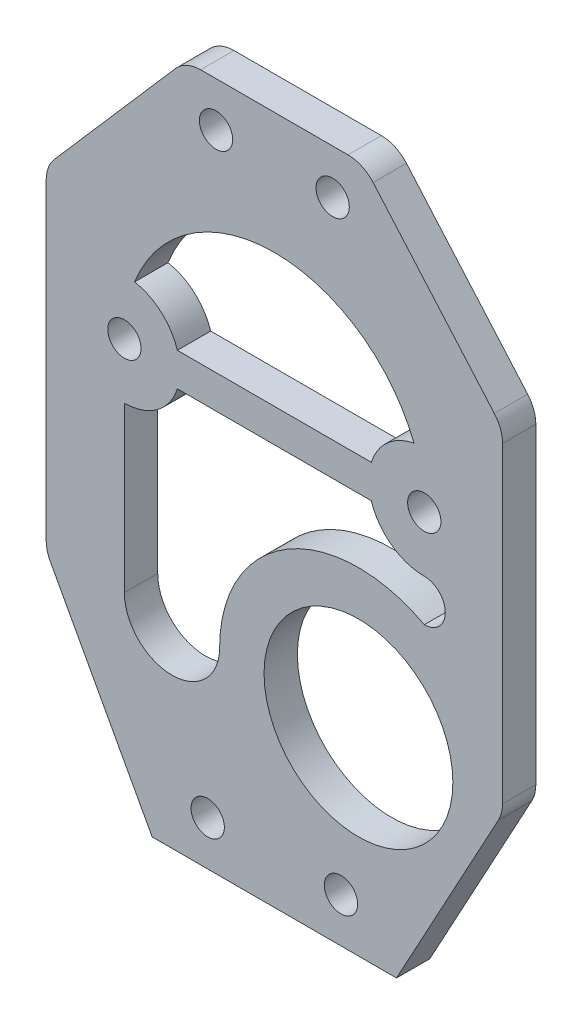
ISO-10303-21;
HEADER;
FILE_DESCRIPTION(('STEP AP214'),'2;1');
FILE_NAME('part.step','',(''),(''),'','','');
FILE_SCHEMA(('AUTOMOTIVE_DESIGN { 1 0 10303 214 1 1 1 1 }'));
ENDSEC;
DATA;
#1=APPLICATION_CONTEXT('core data for automotive mechanical design processes');
#2=APPLICATION_PROTOCOL_DEFINITION('international standard','automotive_design',2000,#1);
#3=PRODUCT_CONTEXT('',#1,'mechanical');
#4=PRODUCT('Part','Part','',(#3));
#5=PRODUCT_RELATED_PRODUCT_CATEGORY('part','',(#4));
#6=PRODUCT_DEFINITION_FORMATION('','',#4);
#7=PRODUCT_DEFINITION_CONTEXT('part definition',#1,'design');
#8=PRODUCT_DEFINITION('design','',#6,#7);
#9=PRODUCT_DEFINITION_SHAPE('','',#8);
#10=(LENGTH_UNIT() NAMED_UNIT(*) SI_UNIT(.MILLI.,.METRE.));
#11=(NAMED_UNIT(*) PLANE_ANGLE_UNIT() SI_UNIT($,.RADIAN.));
#12=(NAMED_UNIT(*) SI_UNIT($,.STERADIAN.) SOLID_ANGLE_UNIT());
#13=UNCERTAINTY_MEASURE_WITH_UNIT(LENGTH_MEASURE(1.E-05),#10,'distance_accuracy_value','');
#14=(GEOMETRIC_REPRESENTATION_CONTEXT(3) GLOBAL_UNCERTAINTY_ASSIGNED_CONTEXT((#13)) GLOBAL_UNIT_ASSIGNED_CONTEXT((#10,
#11,#12)) REPRESENTATION_CONTEXT('',''));
#15=CARTESIAN_POINT('',(0.,0.,0.));
#16=DIRECTION('',(0.,0.,1.));
#17=DIRECTION('',(1.,0.,0.));
#18=AXIS2_PLACEMENT_3D('',#15,#16,#17);
#19=CARTESIAN_POINT('',(-13.5,0.,3.));
#20=DIRECTION('',(1.,0.,0.));
#21=DIRECTION('',(0.,1.,0.));
#22=AXIS2_PLACEMENT_3D('',#19,#20,#21);
#23=PLANE('',#22);
#24=DIRECTION('',(0.,-1.,0.));
#25=VECTOR('',#24,1.);
#26=CARTESIAN_POINT('',(-13.5,0.,0.));
#27=LINE('',#26,#25);
#28=CARTESIAN_POINT('',(-13.5,32.5763422532393,0.));
#29=VERTEX_POINT('',#28);
#30=CARTESIAN_POINT('',(-13.5,17.790765320253,0.));
#31=VERTEX_POINT('',#30);
#32=EDGE_CURVE('E360',#29,#31,#27,.T.);
#33=ORIENTED_EDGE('',*,*,#32,.F.);
#34=DIRECTION('',(0.,0.,-1.));
#35=VECTOR('',#34,1.);
#36=CARTESIAN_POINT('',(-13.5,32.5763422532393,3.));
#37=LINE('',#36,#35);
#38=CARTESIAN_POINT('',(-13.5,32.5763422532393,3.));
#39=VERTEX_POINT('',#38);
#40=EDGE_CURVE('E392',#39,#29,#37,.T.);
#41=ORIENTED_EDGE('',*,*,#40,.F.);
#42=DIRECTION('',(0.,-1.,0.));
#43=VECTOR('',#42,1.);
#44=CARTESIAN_POINT('',(-13.5,0.,3.));
#45=LINE('',#44,#43);
#46=CARTESIAN_POINT('',(-13.5,17.790765320253,3.));
#47=VERTEX_POINT('',#46);
#48=EDGE_CURVE('E287',#39,#47,#45,.T.);
#49=ORIENTED_EDGE('',*,*,#48,.T.);
#50=DIRECTION('',(0.,0.,-1.));
#51=VECTOR('',#50,1.);
#52=CARTESIAN_POINT('',(-13.5,17.790765320253,3.));
#53=LINE('',#52,#51);
#54=EDGE_CURVE('E377',#47,#31,#53,.T.);
#55=ORIENTED_EDGE('',*,*,#54,.T.);
#56=EDGE_LOOP('',(#33,#41,#49,#55));
#57=FACE_BOUND('',#56,.T.);
#58=ADVANCED_FACE('F41',(#57),#23,.T.);
#59=CARTESIAN_POINT('',(-13.5,37.5763422532393,3.));
#60=DIRECTION('',(0.,0.,-1.));
#61=DIRECTION('',(-1.,0.,0.));
#62=AXIS2_PLACEMENT_3D('',#59,#60,#61);
#63=CYLINDRICAL_SURFACE('',#62,5.);
#64=CARTESIAN_POINT('',(-13.5,37.5763422532393,0.));
#65=DIRECTION('',(0.,0.,1.));
#66=DIRECTION('',(1.,0.,0.));
#67=AXIS2_PLACEMENT_3D('',#64,#65,#66);
#68=CIRCLE('',#67,5.);
#69=CARTESIAN_POINT('',(-8.73030399291527,36.0763422532393,0.));
#70=VERTEX_POINT('',#69);
#71=EDGE_CURVE('E363',#29,#70,#68,.T.);
#72=ORIENTED_EDGE('',*,*,#71,.T.);
#73=DIRECTION('',(0.,0.,-1.));
#74=VECTOR('',#73,1.);
#75=CARTESIAN_POINT('',(-8.73030399291527,36.0763422532393,3.));
#76=LINE('',#75,#74);
#77=CARTESIAN_POINT('',(-8.73030399291527,36.0763422532393,3.));
#78=VERTEX_POINT('',#77);
#79=EDGE_CURVE('E389',#78,#70,#76,.T.);
#80=ORIENTED_EDGE('',*,*,#79,.F.);
#81=CARTESIAN_POINT('',(-13.5,37.5763422532393,3.));
#82=DIRECTION('',(0.,0.,1.));
#83=DIRECTION('',(1.,0.,0.));
#84=AXIS2_PLACEMENT_3D('',#81,#82,#83);
#85=CIRCLE('',#84,5.);
#86=EDGE_CURVE('E290',#39,#78,#85,.T.);
#87=ORIENTED_EDGE('',*,*,#86,.F.);
#88=ORIENTED_EDGE('',*,*,#40,.T.);
#89=EDGE_LOOP('',(#72,#80,#87,#88));
#90=FACE_BOUND('',#89,.T.);
#91=ADVANCED_FACE('F516',(#90),#63,.T.);
#92=CARTESIAN_POINT('',(0.,36.0763422532393,3.));
#93=DIRECTION('',(0.,1.,0.));
#94=DIRECTION('',(0.,0.,1.));
#95=AXIS2_PLACEMENT_3D('',#92,#93,#94);
#96=PLANE('',#95);
#97=DIRECTION('',(1.,0.,0.));
#98=VECTOR('',#97,1.);
#99=CARTESIAN_POINT('',(0.,36.0763422532393,0.));
#100=LINE('',#99,#98);
#101=CARTESIAN_POINT('',(8.73030399291527,36.0763422532393,0.));
#102=VERTEX_POINT('',#101);
#103=EDGE_CURVE('E366',#70,#102,#100,.T.);
#104=ORIENTED_EDGE('',*,*,#103,.T.);
#105=DIRECTION('',(0.,0.,-1.));
#106=VECTOR('',#105,1.);
#107=CARTESIAN_POINT('',(8.73030399291527,36.0763422532393,3.));
#108=LINE('',#107,#106);
#109=CARTESIAN_POINT('',(8.73030399291527,36.0763422532393,3.));
#110=VERTEX_POINT('',#109);
#111=EDGE_CURVE('E386',#110,#102,#108,.T.);
#112=ORIENTED_EDGE('',*,*,#111,.F.);
#113=DIRECTION('',(1.,0.,0.));
#114=VECTOR('',#113,1.);
#115=CARTESIAN_POINT('',(0.,36.0763422532393,3.));
#116=LINE('',#115,#114);
#117=EDGE_CURVE('E293',#78,#110,#116,.T.);
#118=ORIENTED_EDGE('',*,*,#117,.F.);
#119=ORIENTED_EDGE('',*,*,#79,.T.);
#120=EDGE_LOOP('',(#104,#112,#118,#119));
#121=FACE_BOUND('',#120,.T.);
#122=ADVANCED_FACE('F522',(#121),#96,.F.);
#123=CARTESIAN_POINT('',(13.5,37.5763422532393,3.));
#124=DIRECTION('',(0.,0.,-1.));
#125=DIRECTION('',(-1.,0.,0.));
#126=AXIS2_PLACEMENT_3D('',#123,#124,#125);
#127=CYLINDRICAL_SURFACE('',#126,5.);
#128=CARTESIAN_POINT('',(13.5,37.5763422532393,0.));
#129=DIRECTION('',(0.,0.,1.));
#130=DIRECTION('',(1.,0.,0.));
#131=AXIS2_PLACEMENT_3D('',#128,#129,#130);
#132=CIRCLE('',#131,5.);
#133=CARTESIAN_POINT('',(13.5,32.5763422532393,0.));
#134=VERTEX_POINT('',#133);
#135=EDGE_CURVE('E369',#102,#134,#132,.T.);
#136=ORIENTED_EDGE('',*,*,#135,.T.);
#137=DIRECTION('',(0.,0.,-1.));
#138=VECTOR('',#137,1.);
#139=CARTESIAN_POINT('',(13.5,32.5763422532393,3.));
#140=LINE('',#139,#138);
#141=CARTESIAN_POINT('',(13.5,32.5763422532393,3.));
#142=VERTEX_POINT('',#141);
#143=EDGE_CURVE('E384',#142,#134,#140,.T.);
#144=ORIENTED_EDGE('',*,*,#143,.F.);
#145=CARTESIAN_POINT('',(13.5,37.5763422532393,3.));
#146=DIRECTION('',(0.,0.,1.));
#147=DIRECTION('',(1.,0.,0.));
#148=AXIS2_PLACEMENT_3D('',#145,#146,#147);
#149=CIRCLE('',#148,5.);
#150=EDGE_CURVE('E296',#110,#142,#149,.T.);
#151=ORIENTED_EDGE('',*,*,#150,.F.);
#152=ORIENTED_EDGE('',*,*,#111,.T.);
#153=EDGE_LOOP('',(#136,#144,#151,#152));
#154=FACE_BOUND('',#153,.T.);
#155=ADVANCED_FACE('F775',(#154),#127,.T.);
#156=CARTESIAN_POINT('',(13.5,30.6865179861669,3.));
#157=DIRECTION('',(0.,0.,-1.));
#158=DIRECTION('',(-1.,0.,0.));
#159=AXIS2_PLACEMENT_3D('',#156,#157,#158);
#160=CYLINDRICAL_SURFACE('',#159,1.88982426707241);
#161=CARTESIAN_POINT('',(13.5,30.6865179861669,0.));
#162=DIRECTION('',(0.,0.,1.));
#163=DIRECTION('',(1.,0.,0.));
#164=AXIS2_PLACEMENT_3D('',#161,#162,#163);
#165=CIRCLE('',#164,1.88982426707241);
#166=CARTESIAN_POINT('',(13.5,28.7966937190945,0.));
#167=VERTEX_POINT('',#166);
#168=EDGE_CURVE('E372',#167,#134,#165,.T.);
#169=ORIENTED_EDGE('',*,*,#168,.F.);
#170=DIRECTION('',(0.,0.,-1.));
#171=VECTOR('',#170,1.);
#172=CARTESIAN_POINT('',(13.5,28.7966937190945,3.));
#173=LINE('',#172,#171);
#174=CARTESIAN_POINT('',(13.5,28.7966937190945,3.));
#175=VERTEX_POINT('',#174);
#176=EDGE_CURVE('E382',#175,#167,#173,.T.);
#177=ORIENTED_EDGE('',*,*,#176,.F.);
#178=CARTESIAN_POINT('',(13.5,30.6865179861669,3.));
#179=DIRECTION('',(0.,0.,1.));
#180=DIRECTION('',(1.,0.,0.));
#181=AXIS2_PLACEMENT_3D('',#178,#179,#180);
#182=CIRCLE('',#181,1.88982426707241);
#183=EDGE_CURVE('E298',#175,#142,#182,.T.);
#184=ORIENTED_EDGE('',*,*,#183,.T.);
#185=ORIENTED_EDGE('',*,*,#143,.T.);
#186=EDGE_LOOP('',(#169,#177,#184,#185));
#187=FACE_BOUND('',#186,.T.);
#188=ADVANCED_FACE('F766',(#187),#160,.F.);
#189=CARTESIAN_POINT('',(7.57382584802186,17.790765320253,3.));
#190=DIRECTION('',(0.,0.,-1.));
#191=DIRECTION('',(-1.,0.,0.));
#192=AXIS2_PLACEMENT_3D('',#189,#190,#191);
#193=CYLINDRICAL_SURFACE('',#192,12.5);
#194=CARTESIAN_POINT('',(7.57382584802186,17.790765320253,0.));
#195=DIRECTION('',(0.,0.,1.));
#196=DIRECTION('',(1.,0.,0.));
#197=AXIS2_PLACEMENT_3D('',#194,#195,#196);
#198=CIRCLE('',#197,12.5);
#199=CARTESIAN_POINT('',(-4.92617415197814,17.790765320253,0.));
#200=VERTEX_POINT('',#199);
#201=EDGE_CURVE('E239',#167,#200,#198,.T.);
#202=ORIENTED_EDGE('',*,*,#201,.T.);
#203=DIRECTION('',(0.,0.,-1.));
#204=VECTOR('',#203,1.);
#205=CARTESIAN_POINT('',(-4.92617415197814,17.790765320253,3.));
#206=LINE('',#205,#204);
#207=CARTESIAN_POINT('',(-4.92617415197814,17.790765320253,3.));
#208=VERTEX_POINT('',#207);
#209=EDGE_CURVE('E379',#208,#200,#206,.T.);
#210=ORIENTED_EDGE('',*,*,#209,.F.);
#211=CARTESIAN_POINT('',(7.57382584802186,17.790765320253,3.));
#212=DIRECTION('',(0.,0.,1.));
#213=DIRECTION('',(1.,0.,0.));
#214=AXIS2_PLACEMENT_3D('',#211,#212,#213);
#215=CIRCLE('',#214,12.5);
#216=EDGE_CURVE('E301',#175,#208,#215,.T.);
#217=ORIENTED_EDGE('',*,*,#216,.F.);
#218=ORIENTED_EDGE('',*,*,#176,.T.);
#219=EDGE_LOOP('',(#202,#210,#217,#218));
#220=FACE_BOUND('',#219,.T.);
#221=ADVANCED_FACE('F759',(#220),#193,.T.);
#222=CARTESIAN_POINT('',(-35.255136379797,30.6587524647866,3.));
#223=DIRECTION('',(-0.754583137173265,0.656204456776814,0.));
#224=DIRECTION('',(-0.656204456776814,-0.754583137173265,0.));
#225=AXIS2_PLACEMENT_3D('',#222,#223,#224);
#226=PLANE('',#225);
#227=DIRECTION('',(0.656204456776814,0.754583137173265,0.));
#228=VECTOR('',#227,1.);
#229=CARTESIAN_POINT('',(-35.255136379797,30.6587524647866,3.));
#230=LINE('',#229,#228);
#231=CARTESIAN_POINT('',(-19.8069246167119,48.4229721001774,3.));
#232=VERTEX_POINT('',#231);
#233=CARTESIAN_POINT('',(-8.89691972919582,60.9686133703304,3.));
#234=VERTEX_POINT('',#233);
#235=EDGE_CURVE('E265',#232,#234,#230,.T.);
#236=ORIENTED_EDGE('',*,*,#235,.T.);
#237=DIRECTION('',(0.,0.,-1.));
#238=VECTOR('',#237,1.);
#239=CARTESIAN_POINT('',(-8.89691972919582,60.9686133703304,0.));
#240=LINE('',#239,#238);
#241=CARTESIAN_POINT('',(-8.89691972919582,60.9686133703304,0.));
#242=VERTEX_POINT('',#241);
#243=EDGE_CURVE('E442',#234,#242,#240,.T.);
#244=ORIENTED_EDGE('',*,*,#243,.T.);
#245=DIRECTION('',(0.656204456776814,0.754583137173265,0.));
#246=VECTOR('',#245,1.);
#247=CARTESIAN_POINT('',(-35.255136379797,30.6587524647866,0.));
#248=LINE('',#247,#246);
#249=CARTESIAN_POINT('',(-19.8069246167119,48.4229721001774,0.));
#250=VERTEX_POINT('',#249);
#251=EDGE_CURVE('E337',#250,#242,#248,.T.);
#252=ORIENTED_EDGE('',*,*,#251,.F.);
#253=DIRECTION('',(0.,0.,-1.));
#254=VECTOR('',#253,1.);
#255=CARTESIAN_POINT('',(-19.8069246167119,48.4229721001774,3.));
#256=LINE('',#255,#254);
#257=EDGE_CURVE('E440',#250,#232,#256,.F.);
#258=ORIENTED_EDGE('',*,*,#257,.T.);
#259=EDGE_LOOP('',(#236,#244,#252,#258));
#260=FACE_BOUND('',#259,.T.);
#261=ADVANCED_FACE('F475',(#260),#226,.T.);
#262=CARTESIAN_POINT('',(-20.5431752051921,0.,3.));
#263=DIRECTION('',(-1.,0.,0.));
#264=DIRECTION('',(0.,0.,1.));
#265=AXIS2_PLACEMENT_3D('',#262,#263,#264);
#266=PLANE('',#265);
#267=DIRECTION('',(0.,1.,0.));
#268=VECTOR('',#267,1.);
#269=CARTESIAN_POINT('',(-20.5431752051921,0.,3.));
#270=LINE('',#269,#268);
#271=CARTESIAN_POINT('',(-20.5431752051921,18.3382451926642,3.));
#272=VERTEX_POINT('',#271);
#273=CARTESIAN_POINT('',(-20.5431752051921,46.454358729847,3.));
#274=VERTEX_POINT('',#273);
#275=EDGE_CURVE('E268',#272,#274,#270,.T.);
#276=ORIENTED_EDGE('',*,*,#275,.T.);
#277=DIRECTION('',(0.,0.,-1.));
#278=VECTOR('',#277,1.);
#279=CARTESIAN_POINT('',(-20.5431752051921,46.454358729847,3.));
#280=LINE('',#279,#278);
#281=CARTESIAN_POINT('',(-20.5431752051921,46.454358729847,0.));
#282=VERTEX_POINT('',#281);
#283=EDGE_CURVE('E49',#274,#282,#280,.T.);
#284=ORIENTED_EDGE('',*,*,#283,.T.);
#285=DIRECTION('',(0.,1.,0.));
#286=VECTOR('',#285,1.);
#287=CARTESIAN_POINT('',(-20.5431752051921,0.,0.));
#288=LINE('',#287,#286);
#289=CARTESIAN_POINT('',(-20.5431752051921,18.3382451926642,0.));
#290=VERTEX_POINT('',#289);
#291=EDGE_CURVE('E340',#290,#282,#288,.T.);
#292=ORIENTED_EDGE('',*,*,#291,.F.);
#293=DIRECTION('',(0.,0.,-1.));
#294=VECTOR('',#293,1.);
#295=CARTESIAN_POINT('',(-20.5431752051921,18.3382451926642,3.));
#296=LINE('',#295,#294);
#297=EDGE_CURVE('E445',#290,#272,#296,.F.);
#298=ORIENTED_EDGE('',*,*,#297,.T.);
#299=EDGE_LOOP('',(#276,#284,#292,#298));
#300=FACE_BOUND('',#299,.T.);
#301=ADVANCED_FACE('F450',(#300),#266,.T.);
#302=CARTESIAN_POINT('',(-8.49551469258267,-4.61268812369982,3.));
#303=DIRECTION('',(-0.878817112661967,-0.477158760259606,0.));
#304=DIRECTION('',(0.477158760259606,-0.878817112661967,0.));
#305=AXIS2_PLACEMENT_3D('',#302,#303,#304);
#306=PLANE('',#305);
#307=DIRECTION('',(-0.477158760259606,0.878817112661967,0.));
#308=VECTOR('',#307,1.);
#309=CARTESIAN_POINT('',(-8.49551469258267,-4.61268812369982,3.));
#310=LINE('',#309,#308);
#311=CARTESIAN_POINT('',(-11.,0.,3.));
#312=VERTEX_POINT('',#311);
#313=CARTESIAN_POINT('',(-20.179626543178,16.9067689118853,3.));
#314=VERTEX_POINT('',#313);
#315=EDGE_CURVE('E271',#312,#314,#310,.T.);
#316=ORIENTED_EDGE('',*,*,#315,.T.);
#317=DIRECTION('',(0.,0.,-1.));
#318=VECTOR('',#317,1.);
#319=CARTESIAN_POINT('',(-20.179626543178,16.9067689118853,3.));
#320=LINE('',#319,#318);
#321=CARTESIAN_POINT('',(-20.179626543178,16.9067689118853,0.));
#322=VERTEX_POINT('',#321);
#323=EDGE_CURVE('E11',#314,#322,#320,.T.);
#324=ORIENTED_EDGE('',*,*,#323,.T.);
#325=DIRECTION('',(-0.477158760259606,0.878817112661967,0.));
#326=VECTOR('',#325,1.);
#327=CARTESIAN_POINT('',(-8.49551469258267,-4.61268812369982,0.));
#328=LINE('',#327,#326);
#329=CARTESIAN_POINT('',(-11.,0.,0.));
#330=VERTEX_POINT('',#329);
#331=EDGE_CURVE('E343',#330,#322,#328,.T.);
#332=ORIENTED_EDGE('',*,*,#331,.F.);
#333=DIRECTION('',(0.,0.,-1.));
#334=VECTOR('',#333,1.);
#335=CARTESIAN_POINT('',(-11.,0.,3.));
#336=LINE('',#335,#334);
#337=EDGE_CURVE('E380',#312,#330,#336,.T.);
#338=ORIENTED_EDGE('',*,*,#337,.F.);
#339=EDGE_LOOP('',(#316,#324,#332,#338));
#340=FACE_BOUND('',#339,.T.);
#341=ADVANCED_FACE('F466',(#340),#306,.T.);
#342=CARTESIAN_POINT('',(0.,0.,3.));
#343=DIRECTION('',(0.,1.,0.));
#344=DIRECTION('',(0.,0.,1.));
#345=AXIS2_PLACEMENT_3D('',#342,#343,#344);
#346=PLANE('',#345);
#347=DIRECTION('',(1.,0.,0.));
#348=VECTOR('',#347,1.);
#349=CARTESIAN_POINT('',(0.,0.,0.));
#350=LINE('',#349,#348);
#351=CARTESIAN_POINT('',(11.,0.,0.));
#352=VERTEX_POINT('',#351);
#353=EDGE_CURVE('E346',#330,#352,#350,.T.);
#354=ORIENTED_EDGE('',*,*,#353,.T.);
#355=DIRECTION('',(0.,0.,-1.));
#356=VECTOR('',#355,1.);
#357=CARTESIAN_POINT('',(11.,0.,3.));
#358=LINE('',#357,#356);
#359=CARTESIAN_POINT('',(11.,0.,3.));
#360=VERTEX_POINT('',#359);
#361=EDGE_CURVE('E220',#360,#352,#358,.T.);
#362=ORIENTED_EDGE('',*,*,#361,.F.);
#363=DIRECTION('',(1.,0.,0.));
#364=VECTOR('',#363,1.);
#365=CARTESIAN_POINT('',(0.,0.,3.));
#366=LINE('',#365,#364);
#367=EDGE_CURVE('E274',#312,#360,#366,.T.);
#368=ORIENTED_EDGE('',*,*,#367,.F.);
#369=ORIENTED_EDGE('',*,*,#337,.T.);
#370=EDGE_LOOP('',(#354,#362,#368,#369));
#371=FACE_BOUND('',#370,.T.);
#372=ADVANCED_FACE('F506',(#371),#346,.F.);
#373=CARTESIAN_POINT('',(8.49551469258267,-4.61268812369982,3.));
#374=DIRECTION('',(-0.878817112661967,0.477158760259606,0.));
#375=DIRECTION('',(-0.477158760259606,-0.878817112661967,0.));
#376=AXIS2_PLACEMENT_3D('',#373,#374,#375);
#377=PLANE('',#376);
#378=DIRECTION('',(0.477158760259606,0.878817112661967,0.));
#379=VECTOR('',#378,1.);
#380=CARTESIAN_POINT('',(8.49551469258267,-4.61268812369982,0.));
#381=LINE('',#380,#379);
#382=CARTESIAN_POINT('',(20.179626543178,16.9067689118853,0.));
#383=VERTEX_POINT('',#382);
#384=EDGE_CURVE('E349',#352,#383,#381,.T.);
#385=ORIENTED_EDGE('',*,*,#384,.T.);
#386=DIRECTION('',(0.,0.,-1.));
#387=VECTOR('',#386,1.);
#388=CARTESIAN_POINT('',(20.179626543178,16.9067689118853,3.));
#389=LINE('',#388,#387);
#390=CARTESIAN_POINT('',(20.179626543178,16.9067689118853,3.));
#391=VERTEX_POINT('',#390);
#392=EDGE_CURVE('E418',#383,#391,#389,.F.);
#393=ORIENTED_EDGE('',*,*,#392,.T.);
#394=DIRECTION('',(0.477158760259606,0.878817112661967,0.));
#395=VECTOR('',#394,1.);
#396=CARTESIAN_POINT('',(8.49551469258267,-4.61268812369982,3.));
#397=LINE('',#396,#395);
#398=EDGE_CURVE('E277',#360,#391,#397,.T.);
#399=ORIENTED_EDGE('',*,*,#398,.F.);
#400=ORIENTED_EDGE('',*,*,#361,.T.);
#401=EDGE_LOOP('',(#385,#393,#399,#400));
#402=FACE_BOUND('',#401,.T.);
#403=ADVANCED_FACE('F504',(#402),#377,.F.);
#404=CARTESIAN_POINT('',(20.5431752051921,0.,3.));
#405=DIRECTION('',(-1.,0.,0.));
#406=DIRECTION('',(0.,0.,1.));
#407=AXIS2_PLACEMENT_3D('',#404,#405,#406);
#408=PLANE('',#407);
#409=DIRECTION('',(0.,1.,0.));
#410=VECTOR('',#409,1.);
#411=CARTESIAN_POINT('',(20.5431752051921,0.,3.));
#412=LINE('',#411,#410);
#413=CARTESIAN_POINT('',(20.5431752051921,18.3382451926642,3.));
#414=VERTEX_POINT('',#413);
#415=CARTESIAN_POINT('',(20.5431752051921,46.454358729847,3.));
#416=VERTEX_POINT('',#415);
#417=EDGE_CURVE('E280',#414,#416,#412,.T.);
#418=ORIENTED_EDGE('',*,*,#417,.F.);
#419=DIRECTION('',(0.,0.,-1.));
#420=VECTOR('',#419,1.);
#421=CARTESIAN_POINT('',(20.5431752051921,18.3382451926642,3.));
#422=LINE('',#421,#420);
#423=CARTESIAN_POINT('',(20.5431752051921,18.3382451926642,0.));
#424=VERTEX_POINT('',#423);
#425=EDGE_CURVE('E403',#414,#424,#422,.T.);
#426=ORIENTED_EDGE('',*,*,#425,.T.);
#427=DIRECTION('',(0.,1.,0.));
#428=VECTOR('',#427,1.);
#429=CARTESIAN_POINT('',(20.5431752051921,0.,0.));
#430=LINE('',#429,#428);
#431=CARTESIAN_POINT('',(20.5431752051921,46.454358729847,0.));
#432=VERTEX_POINT('',#431);
#433=EDGE_CURVE('E352',#424,#432,#430,.T.);
#434=ORIENTED_EDGE('',*,*,#433,.T.);
#435=DIRECTION('',(0.,0.,-1.));
#436=VECTOR('',#435,1.);
#437=CARTESIAN_POINT('',(20.5431752051921,46.454358729847,3.));
#438=LINE('',#437,#436);
#439=EDGE_CURVE('E394',#432,#416,#438,.F.);
#440=ORIENTED_EDGE('',*,*,#439,.T.);
#441=EDGE_LOOP('',(#418,#426,#434,#440));
#442=FACE_BOUND('',#441,.T.);
#443=ADVANCED_FACE('F497',(#442),#408,.F.);
#444=CARTESIAN_POINT('',(35.255136379797,30.6587524647866,3.));
#445=DIRECTION('',(-0.754583137173265,-0.656204456776814,0.));
#446=DIRECTION('',(0.656204456776814,-0.754583137173265,0.));
#447=AXIS2_PLACEMENT_3D('',#444,#445,#446);
#448=PLANE('',#447);
#449=DIRECTION('',(-0.656204456776814,0.754583137173265,0.));
#450=VECTOR('',#449,1.);
#451=CARTESIAN_POINT('',(35.255136379797,30.6587524647866,3.));
#452=LINE('',#451,#450);
#453=CARTESIAN_POINT('',(19.8069246167119,48.4229721001774,3.));
#454=VERTEX_POINT('',#453);
#455=CARTESIAN_POINT('',(8.89691972919582,60.9686133703304,3.));
#456=VERTEX_POINT('',#455);
#457=EDGE_CURVE('E283',#454,#456,#452,.T.);
#458=ORIENTED_EDGE('',*,*,#457,.F.);
#459=DIRECTION('',(0.,0.,-1.));
#460=VECTOR('',#459,1.);
#461=CARTESIAN_POINT('',(19.8069246167119,48.4229721001774,3.));
#462=LINE('',#461,#460);
#463=CARTESIAN_POINT('',(19.8069246167119,48.4229721001774,0.));
#464=VERTEX_POINT('',#463);
#465=EDGE_CURVE('E433',#454,#464,#462,.T.);
#466=ORIENTED_EDGE('',*,*,#465,.T.);
#467=DIRECTION('',(-0.656204456776814,0.754583137173265,0.));
#468=VECTOR('',#467,1.);
#469=CARTESIAN_POINT('',(35.255136379797,30.6587524647866,0.));
#470=LINE('',#469,#468);
#471=CARTESIAN_POINT('',(8.89691972919582,60.9686133703304,0.));
#472=VERTEX_POINT('',#471);
#473=EDGE_CURVE('E355',#464,#472,#470,.T.);
#474=ORIENTED_EDGE('',*,*,#473,.T.);
#475=DIRECTION('',(0.,0.,-1.));
#476=VECTOR('',#475,1.);
#477=CARTESIAN_POINT('',(8.89691972919582,60.9686133703304,3.));
#478=LINE('',#477,#476);
#479=EDGE_CURVE('E431',#472,#456,#478,.F.);
#480=ORIENTED_EDGE('',*,*,#479,.T.);
#481=EDGE_LOOP('',(#458,#466,#474,#480));
#482=FACE_BOUND('',#481,.T.);
#483=ADVANCED_FACE('F489',(#482),#448,.F.);
#484=CARTESIAN_POINT('',(0.,37.5763422532393,3.));
#485=DIRECTION('',(0.,0.,-1.));
#486=DIRECTION('',(-1.,0.,0.));
#487=AXIS2_PLACEMENT_3D('',#484,#485,#486);
#488=CYLINDRICAL_SURFACE('',#487,13.5);
#489=CARTESIAN_POINT('',(0.,37.5763422532393,0.));
#490=DIRECTION('',(0.,0.,1.));
#491=DIRECTION('',(1.,0.,0.));
#492=AXIS2_PLACEMENT_3D('',#489,#490,#491);
#493=CIRCLE('',#492,13.5);
#494=CARTESIAN_POINT('',(12.5740740740741,42.4898604611733,0.));
#495=VERTEX_POINT('',#494);
#496=CARTESIAN_POINT('',(-12.5740740740741,42.4898604611733,0.));
#497=VERTEX_POINT('',#496);
#498=EDGE_CURVE('E216',#495,#497,#493,.T.);
#499=ORIENTED_EDGE('',*,*,#498,.F.);
#500=DIRECTION('',(0.,0.,-1.));
#501=VECTOR('',#500,1.);
#502=CARTESIAN_POINT('',(12.5740740740741,42.4898604611733,3.));
#503=LINE('',#502,#501);
#504=CARTESIAN_POINT('',(12.5740740740741,42.4898604611733,3.));
#505=VERTEX_POINT('',#504);
#506=EDGE_CURVE('E210',#505,#495,#503,.T.);
#507=ORIENTED_EDGE('',*,*,#506,.F.);
#508=CARTESIAN_POINT('',(0.,37.5763422532393,3.));
#509=DIRECTION('',(0.,0.,1.));
#510=DIRECTION('',(1.,0.,0.));
#511=AXIS2_PLACEMENT_3D('',#508,#509,#510);
#512=CIRCLE('',#511,13.5);
#513=CARTESIAN_POINT('',(-12.5740740740741,42.4898604611733,3.));
#514=VERTEX_POINT('',#513);
#515=EDGE_CURVE('E214',#505,#514,#512,.T.);
#516=ORIENTED_EDGE('',*,*,#515,.T.);
#517=DIRECTION('',(0.,0.,-1.));
#518=VECTOR('',#517,1.);
#519=CARTESIAN_POINT('',(-12.5740740740741,42.4898604611733,3.));
#520=LINE('',#519,#518);
#521=EDGE_CURVE('E306',#514,#497,#520,.T.);
#522=ORIENTED_EDGE('',*,*,#521,.T.);
#523=EDGE_LOOP('',(#499,#507,#516,#522));
#524=FACE_BOUND('',#523,.T.);
#525=ADVANCED_FACE('F212',(#524),#488,.F.);
#526=CARTESIAN_POINT('',(13.5,37.5763422532393,3.));
#527=DIRECTION('',(0.,0.,-1.));
#528=DIRECTION('',(-1.,0.,0.));
#529=AXIS2_PLACEMENT_3D('',#526,#527,#528);
#530=CYLINDRICAL_SURFACE('',#529,5.);
#531=CARTESIAN_POINT('',(13.5,37.5763422532393,0.));
#532=DIRECTION('',(0.,0.,1.));
#533=DIRECTION('',(1.,0.,0.));
#534=AXIS2_PLACEMENT_3D('',#531,#532,#533);
#535=CIRCLE('',#534,5.);
#536=CARTESIAN_POINT('',(8.73030399291527,39.0763422532393,0.));
#537=VERTEX_POINT('',#536);
#538=EDGE_CURVE('E308',#495,#537,#535,.T.);
#539=ORIENTED_EDGE('',*,*,#538,.T.);
#540=DIRECTION('',(0.,0.,-1.));
#541=VECTOR('',#540,1.);
#542=CARTESIAN_POINT('',(8.73030399291527,39.0763422532393,3.));
#543=LINE('',#542,#541);
#544=CARTESIAN_POINT('',(8.73030399291527,39.0763422532393,3.));
#545=VERTEX_POINT('',#544);
#546=EDGE_CURVE('E221',#545,#537,#543,.T.);
#547=ORIENTED_EDGE('',*,*,#546,.F.);
#548=CARTESIAN_POINT('',(13.5,37.5763422532393,3.));
#549=DIRECTION('',(0.,0.,1.));
#550=DIRECTION('',(1.,0.,0.));
#551=AXIS2_PLACEMENT_3D('',#548,#549,#550);
#552=CIRCLE('',#551,5.);
#553=EDGE_CURVE('E224',#505,#545,#552,.T.);
#554=ORIENTED_EDGE('',*,*,#553,.F.);
#555=ORIENTED_EDGE('',*,*,#506,.T.);
#556=EDGE_LOOP('',(#539,#547,#554,#555));
#557=FACE_BOUND('',#556,.T.);
#558=ADVANCED_FACE('F225',(#557),#530,.T.);
#559=CARTESIAN_POINT('',(0.,39.0763422532393,3.));
#560=DIRECTION('',(0.,1.,0.));
#561=DIRECTION('',(0.,0.,1.));
#562=AXIS2_PLACEMENT_3D('',#559,#560,#561);
#563=PLANE('',#562);
#564=DIRECTION('',(1.,0.,0.));
#565=VECTOR('',#564,1.);
#566=CARTESIAN_POINT('',(0.,39.0763422532393,0.));
#567=LINE('',#566,#565);
#568=CARTESIAN_POINT('',(-8.73030399291527,39.0763422532393,0.));
#569=VERTEX_POINT('',#568);
#570=EDGE_CURVE('E310',#569,#537,#567,.T.);
#571=ORIENTED_EDGE('',*,*,#570,.F.);
#572=DIRECTION('',(0.,0.,-1.));
#573=VECTOR('',#572,1.);
#574=CARTESIAN_POINT('',(-8.73030399291527,39.0763422532393,3.));
#575=LINE('',#574,#573);
#576=CARTESIAN_POINT('',(-8.73030399291527,39.0763422532393,3.));
#577=VERTEX_POINT('',#576);
#578=EDGE_CURVE('E399',#577,#569,#575,.T.);
#579=ORIENTED_EDGE('',*,*,#578,.F.);
#580=DIRECTION('',(1.,0.,0.));
#581=VECTOR('',#580,1.);
#582=CARTESIAN_POINT('',(0.,39.0763422532393,3.));
#583=LINE('',#582,#581);
#584=EDGE_CURVE('E229',#577,#545,#583,.T.);
#585=ORIENTED_EDGE('',*,*,#584,.T.);
#586=ORIENTED_EDGE('',*,*,#546,.T.);
#587=EDGE_LOOP('',(#571,#579,#585,#586));
#588=FACE_BOUND('',#587,.T.);
#589=ADVANCED_FACE('F531',(#588),#563,.T.);
#590=CARTESIAN_POINT('',(0.,62.,3.));
#591=DIRECTION('',(0.,-1.,0.));
#592=DIRECTION('',(0.,0.,-1.));
#593=AXIS2_PLACEMENT_3D('',#590,#591,#592);
#594=PLANE('',#593);
#595=DIRECTION('',(-1.,0.,0.));
#596=VECTOR('',#595,1.);
#597=CARTESIAN_POINT('',(0.,62.,3.));
#598=LINE('',#597,#596);
#599=CARTESIAN_POINT('',(6.63317031767603,62.,3.));
#600=VERTEX_POINT('',#599);
#601=CARTESIAN_POINT('',(-6.63317031767603,62.,3.));
#602=VERTEX_POINT('',#601);
#603=EDGE_CURVE('E285',#600,#602,#598,.T.);
#604=ORIENTED_EDGE('',*,*,#603,.F.);
#605=DIRECTION('',(0.,0.,-1.));
#606=VECTOR('',#605,1.);
#607=CARTESIAN_POINT('',(6.63317031767603,62.,3.));
#608=LINE('',#607,#606);
#609=CARTESIAN_POINT('',(6.63317031767603,62.,0.));
#610=VERTEX_POINT('',#609);
#611=EDGE_CURVE('E437',#600,#610,#608,.T.);
#612=ORIENTED_EDGE('',*,*,#611,.T.);
#613=DIRECTION('',(-1.,0.,0.));
#614=VECTOR('',#613,1.);
#615=CARTESIAN_POINT('',(0.,62.,0.));
#616=LINE('',#615,#614);
#617=CARTESIAN_POINT('',(-6.63317031767603,62.,0.));
#618=VERTEX_POINT('',#617);
#619=EDGE_CURVE('E358',#610,#618,#616,.T.);
#620=ORIENTED_EDGE('',*,*,#619,.T.);
#621=DIRECTION('',(0.,0.,-1.));
#622=VECTOR('',#621,1.);
#623=CARTESIAN_POINT('',(-6.63317031767603,62.,3.));
#624=LINE('',#623,#622);
#625=EDGE_CURVE('E56',#618,#602,#624,.F.);
#626=ORIENTED_EDGE('',*,*,#625,.T.);
#627=EDGE_LOOP('',(#604,#612,#620,#626));
#628=FACE_BOUND('',#627,.T.);
#629=ADVANCED_FACE('F479',(#628),#594,.F.);
#630=CARTESIAN_POINT('',(-6.,4.,3.));
#631=DIRECTION('',(0.,0.,-1.));
#632=DIRECTION('',(-1.,0.,0.));
#633=AXIS2_PLACEMENT_3D('',#630,#631,#632);
#634=CYLINDRICAL_SURFACE('',#633,1.5);
#635=CARTESIAN_POINT('',(-6.,4.,3.));
#636=DIRECTION('',(0.,0.,1.));
#637=DIRECTION('',(1.,0.,0.));
#638=AXIS2_PLACEMENT_3D('',#635,#636,#637);
#639=CIRCLE('',#638,1.5);
#640=CARTESIAN_POINT('',(-4.5,4.,3.));
#641=VERTEX_POINT('',#640);
#642=EDGE_CURVE('E262',#641,#641,#639,.T.);
#643=ORIENTED_EDGE('',*,*,#642,.T.);
#644=EDGE_LOOP('',(#643));
#645=FACE_BOUND('',#644,.T.);
#646=CARTESIAN_POINT('',(-6.,4.,0.));
#647=DIRECTION('',(0.,0.,1.));
#648=DIRECTION('',(1.,0.,0.));
#649=AXIS2_PLACEMENT_3D('',#646,#647,#648);
#650=CIRCLE('',#649,1.5);
#651=CARTESIAN_POINT('',(-4.5,4.,0.));
#652=VERTEX_POINT('',#651);
#653=EDGE_CURVE('E334',#652,#652,#650,.T.);
#654=ORIENTED_EDGE('',*,*,#653,.F.);
#655=EDGE_LOOP('',(#654));
#656=FACE_BOUND('',#655,.T.);
#657=ADVANCED_FACE('F530',(#645,#656),#634,.F.);
#658=CARTESIAN_POINT('',(6.,4.,3.));
#659=DIRECTION('',(0.,0.,-1.));
#660=DIRECTION('',(-1.,0.,0.));
#661=AXIS2_PLACEMENT_3D('',#658,#659,#660);
#662=CYLINDRICAL_SURFACE('',#661,1.5);
#663=CARTESIAN_POINT('',(6.,4.,3.));
#664=DIRECTION('',(0.,0.,1.));
#665=DIRECTION('',(1.,0.,0.));
#666=AXIS2_PLACEMENT_3D('',#663,#664,#665);
#667=CIRCLE('',#666,1.5);
#668=CARTESIAN_POINT('',(7.5,4.,3.));
#669=VERTEX_POINT('',#668);
#670=EDGE_CURVE('E259',#669,#669,#667,.T.);
#671=ORIENTED_EDGE('',*,*,#670,.T.);
#672=EDGE_LOOP('',(#671));
#673=FACE_BOUND('',#672,.T.);
#674=CARTESIAN_POINT('',(6.,4.,0.));
#675=DIRECTION('',(0.,0.,1.));
#676=DIRECTION('',(1.,0.,0.));
#677=AXIS2_PLACEMENT_3D('',#674,#675,#676);
#678=CIRCLE('',#677,1.5);
#679=CARTESIAN_POINT('',(7.5,4.,0.));
#680=VERTEX_POINT('',#679);
#681=EDGE_CURVE('E331',#680,#680,#678,.T.);
#682=ORIENTED_EDGE('',*,*,#681,.F.);
#683=EDGE_LOOP('',(#682));
#684=FACE_BOUND('',#683,.T.);
#685=ADVANCED_FACE('F573',(#673,#684),#662,.F.);
#686=CARTESIAN_POINT('',(-5.25,57.99,3.));
#687=DIRECTION('',(0.,0.,-1.));
#688=DIRECTION('',(-1.,0.,0.));
#689=AXIS2_PLACEMENT_3D('',#686,#687,#688);
#690=CYLINDRICAL_SURFACE('',#689,1.5);
#691=CARTESIAN_POINT('',(-5.25,57.99,3.));
#692=DIRECTION('',(0.,0.,1.));
#693=DIRECTION('',(1.,0.,0.));
#694=AXIS2_PLACEMENT_3D('',#691,#692,#693);
#695=CIRCLE('',#694,1.5);
#696=CARTESIAN_POINT('',(-3.75,57.99,3.));
#697=VERTEX_POINT('',#696);
#698=EDGE_CURVE('E256',#697,#697,#695,.T.);
#699=ORIENTED_EDGE('',*,*,#698,.T.);
#700=EDGE_LOOP('',(#699));
#701=FACE_BOUND('',#700,.T.);
#702=CARTESIAN_POINT('',(-5.25,57.99,0.));
#703=DIRECTION('',(0.,0.,1.));
#704=DIRECTION('',(1.,0.,0.));
#705=AXIS2_PLACEMENT_3D('',#702,#703,#704);
#706=CIRCLE('',#705,1.5);
#707=CARTESIAN_POINT('',(-3.75,57.99,0.));
#708=VERTEX_POINT('',#707);
#709=EDGE_CURVE('E328',#708,#708,#706,.T.);
#710=ORIENTED_EDGE('',*,*,#709,.F.);
#711=EDGE_LOOP('',(#710));
#712=FACE_BOUND('',#711,.T.);
#713=ADVANCED_FACE('F581',(#701,#712),#690,.F.);
#714=CARTESIAN_POINT('',(5.25,57.99,3.));
#715=DIRECTION('',(0.,0.,-1.));
#716=DIRECTION('',(-1.,0.,0.));
#717=AXIS2_PLACEMENT_3D('',#714,#715,#716);
#718=CYLINDRICAL_SURFACE('',#717,1.5);
#719=CARTESIAN_POINT('',(5.25,57.99,3.));
#720=DIRECTION('',(0.,0.,1.));
#721=DIRECTION('',(1.,0.,0.));
#722=AXIS2_PLACEMENT_3D('',#719,#720,#721);
#723=CIRCLE('',#722,1.5);
#724=CARTESIAN_POINT('',(6.75,57.99,3.));
#725=VERTEX_POINT('',#724);
#726=EDGE_CURVE('E253',#725,#725,#723,.T.);
#727=ORIENTED_EDGE('',*,*,#726,.T.);
#728=EDGE_LOOP('',(#727));
#729=FACE_BOUND('',#728,.T.);
#730=CARTESIAN_POINT('',(5.25,57.99,0.));
#731=DIRECTION('',(0.,0.,1.));
#732=DIRECTION('',(1.,0.,0.));
#733=AXIS2_PLACEMENT_3D('',#730,#731,#732);
#734=CIRCLE('',#733,1.5);
#735=CARTESIAN_POINT('',(6.75,57.99,0.));
#736=VERTEX_POINT('',#735);
#737=EDGE_CURVE('E325',#736,#736,#734,.T.);
#738=ORIENTED_EDGE('',*,*,#737,.F.);
#739=EDGE_LOOP('',(#738));
#740=FACE_BOUND('',#739,.T.);
#741=ADVANCED_FACE('F589',(#729,#740),#718,.F.);
#742=CARTESIAN_POINT('',(-13.5,37.5763422532393,3.));
#743=DIRECTION('',(0.,0.,-1.));
#744=DIRECTION('',(-1.,0.,0.));
#745=AXIS2_PLACEMENT_3D('',#742,#743,#744);
#746=CYLINDRICAL_SURFACE('',#745,1.5);
#747=CARTESIAN_POINT('',(-13.5,37.5763422532393,3.));
#748=DIRECTION('',(0.,0.,1.));
#749=DIRECTION('',(1.,0.,0.));
#750=AXIS2_PLACEMENT_3D('',#747,#748,#749);
#751=CIRCLE('',#750,1.5);
#752=CARTESIAN_POINT('',(-12.,37.5763422532393,3.));
#753=VERTEX_POINT('',#752);
#754=EDGE_CURVE('E250',#753,#753,#751,.T.);
#755=ORIENTED_EDGE('',*,*,#754,.T.);
#756=EDGE_LOOP('',(#755));
#757=FACE_BOUND('',#756,.T.);
#758=CARTESIAN_POINT('',(-13.5,37.5763422532393,0.));
#759=DIRECTION('',(0.,0.,1.));
#760=DIRECTION('',(1.,0.,0.));
#761=AXIS2_PLACEMENT_3D('',#758,#759,#760);
#762=CIRCLE('',#761,1.5);
#763=CARTESIAN_POINT('',(-12.,37.5763422532393,0.));
#764=VERTEX_POINT('',#763);
#765=EDGE_CURVE('E322',#764,#764,#762,.T.);
#766=ORIENTED_EDGE('',*,*,#765,.F.);
#767=EDGE_LOOP('',(#766));
#768=FACE_BOUND('',#767,.T.);
#769=ADVANCED_FACE('F597',(#757,#768),#746,.F.);
#770=CARTESIAN_POINT('',(13.5,37.5763422532393,3.));
#771=DIRECTION('',(0.,0.,-1.));
#772=DIRECTION('',(-1.,0.,0.));
#773=AXIS2_PLACEMENT_3D('',#770,#771,#772);
#774=CYLINDRICAL_SURFACE('',#773,1.5);
#775=CARTESIAN_POINT('',(13.5,37.5763422532393,3.));
#776=DIRECTION('',(0.,0.,1.));
#777=DIRECTION('',(1.,0.,0.));
#778=AXIS2_PLACEMENT_3D('',#775,#776,#777);
#779=CIRCLE('',#778,1.5);
#780=CARTESIAN_POINT('',(15.,37.5763422532393,3.));
#781=VERTEX_POINT('',#780);
#782=EDGE_CURVE('E247',#781,#781,#779,.T.);
#783=ORIENTED_EDGE('',*,*,#782,.T.);
#784=EDGE_LOOP('',(#783));
#785=FACE_BOUND('',#784,.T.);
#786=CARTESIAN_POINT('',(13.5,37.5763422532393,0.));
#787=DIRECTION('',(0.,0.,1.));
#788=DIRECTION('',(1.,0.,0.));
#789=AXIS2_PLACEMENT_3D('',#786,#787,#788);
#790=CIRCLE('',#789,1.5);
#791=CARTESIAN_POINT('',(15.,37.5763422532393,0.));
#792=VERTEX_POINT('',#791);
#793=EDGE_CURVE('E319',#792,#792,#790,.T.);
#794=ORIENTED_EDGE('',*,*,#793,.F.);
#795=EDGE_LOOP('',(#794));
#796=FACE_BOUND('',#795,.T.);
#797=ADVANCED_FACE('F605',(#785,#796),#774,.F.);
#798=CARTESIAN_POINT('',(7.57382584802186,17.790765320253,3.));
#799=DIRECTION('',(0.,0.,-1.));
#800=DIRECTION('',(-1.,0.,0.));
#801=AXIS2_PLACEMENT_3D('',#798,#799,#800);
#802=CYLINDRICAL_SURFACE('',#801,8.5);
#803=CARTESIAN_POINT('',(7.57382584802186,17.790765320253,3.));
#804=DIRECTION('',(0.,0.,1.));
#805=DIRECTION('',(1.,0.,0.));
#806=AXIS2_PLACEMENT_3D('',#803,#804,#805);
#807=CIRCLE('',#806,8.5);
#808=CARTESIAN_POINT('',(16.0738258480219,17.790765320253,3.));
#809=VERTEX_POINT('',#808);
#810=EDGE_CURVE('E244',#809,#809,#807,.T.);
#811=ORIENTED_EDGE('',*,*,#810,.T.);
#812=EDGE_LOOP('',(#811));
#813=FACE_BOUND('',#812,.T.);
#814=CARTESIAN_POINT('',(7.57382584802186,17.790765320253,0.));
#815=DIRECTION('',(0.,0.,1.));
#816=DIRECTION('',(1.,0.,0.));
#817=AXIS2_PLACEMENT_3D('',#814,#815,#816);
#818=CIRCLE('',#817,8.5);
#819=CARTESIAN_POINT('',(16.0738258480219,17.790765320253,0.));
#820=VERTEX_POINT('',#819);
#821=EDGE_CURVE('E316',#820,#820,#818,.T.);
#822=ORIENTED_EDGE('',*,*,#821,.F.);
#823=EDGE_LOOP('',(#822));
#824=FACE_BOUND('',#823,.T.);
#825=ADVANCED_FACE('F613',(#813,#824),#802,.F.);
#826=CARTESIAN_POINT('',(-13.5,37.5763422532393,3.));
#827=DIRECTION('',(0.,0.,-1.));
#828=DIRECTION('',(-1.,0.,0.));
#829=AXIS2_PLACEMENT_3D('',#826,#827,#828);
#830=CYLINDRICAL_SURFACE('',#829,5.);
#831=CARTESIAN_POINT('',(-13.5,37.5763422532393,0.));
#832=DIRECTION('',(0.,0.,1.));
#833=DIRECTION('',(1.,0.,0.));
#834=AXIS2_PLACEMENT_3D('',#831,#832,#833);
#835=CIRCLE('',#834,5.);
#836=EDGE_CURVE('E313',#569,#497,#835,.T.);
#837=ORIENTED_EDGE('',*,*,#836,.T.);
#838=ORIENTED_EDGE('',*,*,#521,.F.);
#839=CARTESIAN_POINT('',(-13.5,37.5763422532393,3.));
#840=DIRECTION('',(0.,0.,1.));
#841=DIRECTION('',(1.,0.,0.));
#842=AXIS2_PLACEMENT_3D('',#839,#840,#841);
#843=CIRCLE('',#842,5.);
#844=EDGE_CURVE('E234',#577,#514,#843,.T.);
#845=ORIENTED_EDGE('',*,*,#844,.F.);
#846=ORIENTED_EDGE('',*,*,#578,.T.);
#847=EDGE_LOOP('',(#837,#838,#845,#846));
#848=FACE_BOUND('',#847,.T.);
#849=ADVANCED_FACE('F621',(#848),#830,.T.);
#850=CARTESIAN_POINT('',(-9.21308707598907,17.790765320253,3.));
#851=DIRECTION('',(0.,0.,-1.));
#852=DIRECTION('',(-1.,0.,0.));
#853=AXIS2_PLACEMENT_3D('',#850,#851,#852);
#854=CYLINDRICAL_SURFACE('',#853,4.28691292401093);
#855=CARTESIAN_POINT('',(-9.21308707598907,17.790765320253,0.));
#856=DIRECTION('',(0.,0.,1.));
#857=DIRECTION('',(1.,0.,0.));
#858=AXIS2_PLACEMENT_3D('',#855,#856,#857);
#859=CIRCLE('',#858,4.28691292401093);
#860=EDGE_CURVE('E236',#31,#200,#859,.T.);
#861=ORIENTED_EDGE('',*,*,#860,.F.);
#862=ORIENTED_EDGE('',*,*,#54,.F.);
#863=CARTESIAN_POINT('',(-9.21308707598907,17.790765320253,3.));
#864=DIRECTION('',(0.,0.,1.));
#865=DIRECTION('',(1.,0.,0.));
#866=AXIS2_PLACEMENT_3D('',#863,#864,#865);
#867=CIRCLE('',#866,4.28691292401093);
#868=EDGE_CURVE('E303',#47,#208,#867,.T.);
#869=ORIENTED_EDGE('',*,*,#868,.T.);
#870=ORIENTED_EDGE('',*,*,#209,.T.);
#871=EDGE_LOOP('',(#861,#862,#869,#870));
#872=FACE_BOUND('',#871,.T.);
#873=ADVANCED_FACE('F629',(#872),#854,.F.);
#874=CARTESIAN_POINT('',(0.,0.,3.));
#875=DIRECTION('',(0.,0.,1.));
#876=DIRECTION('',(1.,0.,0.));
#877=AXIS2_PLACEMENT_3D('',#874,#875,#876);
#878=PLANE('',#877);
#879=ORIENTED_EDGE('',*,*,#515,.F.);
#880=ORIENTED_EDGE('',*,*,#553,.T.);
#881=ORIENTED_EDGE('',*,*,#584,.F.);
#882=ORIENTED_EDGE('',*,*,#844,.T.);
#883=EDGE_LOOP('',(#879,#880,#881,#882));
#884=FACE_BOUND('',#883,.T.);
#885=ORIENTED_EDGE('',*,*,#810,.F.);
#886=EDGE_LOOP('',(#885));
#887=FACE_BOUND('',#886,.T.);
#888=ORIENTED_EDGE('',*,*,#782,.F.);
#889=EDGE_LOOP('',(#888));
#890=FACE_BOUND('',#889,.T.);
#891=ORIENTED_EDGE('',*,*,#754,.F.);
#892=EDGE_LOOP('',(#891));
#893=FACE_BOUND('',#892,.T.);
#894=ORIENTED_EDGE('',*,*,#726,.F.);
#895=EDGE_LOOP('',(#894));
#896=FACE_BOUND('',#895,.T.);
#897=ORIENTED_EDGE('',*,*,#698,.F.);
#898=EDGE_LOOP('',(#897));
#899=FACE_BOUND('',#898,.T.);
#900=ORIENTED_EDGE('',*,*,#670,.F.);
#901=EDGE_LOOP('',(#900));
#902=FACE_BOUND('',#901,.T.);
#903=ORIENTED_EDGE('',*,*,#642,.F.);
#904=EDGE_LOOP('',(#903));
#905=FACE_BOUND('',#904,.T.);
#906=ORIENTED_EDGE('',*,*,#398,.T.);
#907=CARTESIAN_POINT('',(17.5431752051921,18.3382451926642,3.));
#908=DIRECTION('',(0.,0.,1.));
#909=DIRECTION('',(1.,0.,0.));
#910=AXIS2_PLACEMENT_3D('',#907,#908,#909);
#911=CIRCLE('',#910,3.);
#912=EDGE_CURVE('E429',#391,#414,#911,.T.);
#913=ORIENTED_EDGE('',*,*,#912,.T.);
#914=ORIENTED_EDGE('',*,*,#417,.T.);
#915=CARTESIAN_POINT('',(17.5431752051921,46.454358729847,3.));
#916=DIRECTION('',(0.,0.,1.));
#917=DIRECTION('',(1.,0.,0.));
#918=AXIS2_PLACEMENT_3D('',#915,#916,#917);
#919=CIRCLE('',#918,3.);
#920=EDGE_CURVE('E427',#416,#454,#919,.T.);
#921=ORIENTED_EDGE('',*,*,#920,.T.);
#922=ORIENTED_EDGE('',*,*,#457,.T.);
#923=CARTESIAN_POINT('',(6.63317031767603,59.,3.));
#924=DIRECTION('',(0.,0.,1.));
#925=DIRECTION('',(1.,0.,0.));
#926=AXIS2_PLACEMENT_3D('',#923,#924,#925);
#927=CIRCLE('',#926,3.);
#928=EDGE_CURVE('E63',#456,#600,#927,.T.);
#929=ORIENTED_EDGE('',*,*,#928,.T.);
#930=ORIENTED_EDGE('',*,*,#603,.T.);
#931=CARTESIAN_POINT('',(-6.63317031767603,59.,3.));
#932=DIRECTION('',(0.,0.,1.));
#933=DIRECTION('',(1.,0.,0.));
#934=AXIS2_PLACEMENT_3D('',#931,#932,#933);
#935=CIRCLE('',#934,3.);
#936=EDGE_CURVE('E424',#602,#234,#935,.T.);
#937=ORIENTED_EDGE('',*,*,#936,.T.);
#938=ORIENTED_EDGE('',*,*,#235,.F.);
#939=CARTESIAN_POINT('',(-17.5431752051921,46.454358729847,3.));
#940=DIRECTION('',(0.,0.,1.));
#941=DIRECTION('',(1.,0.,0.));
#942=AXIS2_PLACEMENT_3D('',#939,#940,#941);
#943=CIRCLE('',#942,3.);
#944=EDGE_CURVE('E422',#232,#274,#943,.T.);
#945=ORIENTED_EDGE('',*,*,#944,.T.);
#946=ORIENTED_EDGE('',*,*,#275,.F.);
#947=CARTESIAN_POINT('',(-17.5431752051921,18.3382451926642,3.));
#948=DIRECTION('',(0.,0.,1.));
#949=DIRECTION('',(1.,0.,0.));
#950=AXIS2_PLACEMENT_3D('',#947,#948,#949);
#951=CIRCLE('',#950,3.);
#952=EDGE_CURVE('E420',#272,#314,#951,.T.);
#953=ORIENTED_EDGE('',*,*,#952,.T.);
#954=ORIENTED_EDGE('',*,*,#315,.F.);
#955=ORIENTED_EDGE('',*,*,#367,.T.);
#956=EDGE_LOOP('',(#906,#913,#914,#921,#922,#929,#930,#937,#938,#945,#946,#953,#954,#955));
#957=FACE_BOUND('',#956,.T.);
#958=ORIENTED_EDGE('',*,*,#48,.F.);
#959=ORIENTED_EDGE('',*,*,#86,.T.);
#960=ORIENTED_EDGE('',*,*,#117,.T.);
#961=ORIENTED_EDGE('',*,*,#150,.T.);
#962=ORIENTED_EDGE('',*,*,#183,.F.);
#963=ORIENTED_EDGE('',*,*,#216,.T.);
#964=ORIENTED_EDGE('',*,*,#868,.F.);
#965=EDGE_LOOP('',(#958,#959,#960,#961,#962,#963,#964));
#966=FACE_BOUND('',#965,.T.);
#967=ADVANCED_FACE('F231',(#884,#887,#890,#893,#896,#899,#902,#905,#957,#966),#878,.T.);
#968=CARTESIAN_POINT('',(0.,0.,0.));
#969=DIRECTION('',(0.,0.,1.));
#970=DIRECTION('',(1.,0.,0.));
#971=AXIS2_PLACEMENT_3D('',#968,#969,#970);
#972=PLANE('',#971);
#973=ORIENTED_EDGE('',*,*,#498,.T.);
#974=ORIENTED_EDGE('',*,*,#836,.F.);
#975=ORIENTED_EDGE('',*,*,#570,.T.);
#976=ORIENTED_EDGE('',*,*,#538,.F.);
#977=EDGE_LOOP('',(#973,#974,#975,#976));
#978=FACE_BOUND('',#977,.T.);
#979=ORIENTED_EDGE('',*,*,#821,.T.);
#980=EDGE_LOOP('',(#979));
#981=FACE_BOUND('',#980,.T.);
#982=ORIENTED_EDGE('',*,*,#793,.T.);
#983=EDGE_LOOP('',(#982));
#984=FACE_BOUND('',#983,.T.);
#985=ORIENTED_EDGE('',*,*,#765,.T.);
#986=EDGE_LOOP('',(#985));
#987=FACE_BOUND('',#986,.T.);
#988=ORIENTED_EDGE('',*,*,#737,.T.);
#989=EDGE_LOOP('',(#988));
#990=FACE_BOUND('',#989,.T.);
#991=ORIENTED_EDGE('',*,*,#709,.T.);
#992=EDGE_LOOP('',(#991));
#993=FACE_BOUND('',#992,.T.);
#994=ORIENTED_EDGE('',*,*,#681,.T.);
#995=EDGE_LOOP('',(#994));
#996=FACE_BOUND('',#995,.T.);
#997=ORIENTED_EDGE('',*,*,#653,.T.);
#998=EDGE_LOOP('',(#997));
#999=FACE_BOUND('',#998,.T.);
#1000=ORIENTED_EDGE('',*,*,#433,.F.);
#1001=CARTESIAN_POINT('',(17.5431752051921,18.3382451926642,0.));
#1002=DIRECTION('',(0.,0.,1.));
#1003=DIRECTION('',(1.,0.,0.));
#1004=AXIS2_PLACEMENT_3D('',#1001,#1002,#1003);
#1005=CIRCLE('',#1004,3.);
#1006=EDGE_CURVE('E416',#424,#383,#1005,.F.);
#1007=ORIENTED_EDGE('',*,*,#1006,.T.);
#1008=ORIENTED_EDGE('',*,*,#384,.F.);
#1009=ORIENTED_EDGE('',*,*,#353,.F.);
#1010=ORIENTED_EDGE('',*,*,#331,.T.);
#1011=CARTESIAN_POINT('',(-17.5431752051921,18.3382451926642,0.));
#1012=DIRECTION('',(0.,0.,1.));
#1013=DIRECTION('',(1.,0.,0.));
#1014=AXIS2_PLACEMENT_3D('',#1011,#1012,#1013);
#1015=CIRCLE('',#1014,3.);
#1016=EDGE_CURVE('E406',#322,#290,#1015,.F.);
#1017=ORIENTED_EDGE('',*,*,#1016,.T.);
#1018=ORIENTED_EDGE('',*,*,#291,.T.);
#1019=CARTESIAN_POINT('',(-17.5431752051921,46.454358729847,0.));
#1020=DIRECTION('',(0.,0.,1.));
#1021=DIRECTION('',(1.,0.,0.));
#1022=AXIS2_PLACEMENT_3D('',#1019,#1020,#1021);
#1023=CIRCLE('',#1022,3.);
#1024=EDGE_CURVE('E408',#282,#250,#1023,.F.);
#1025=ORIENTED_EDGE('',*,*,#1024,.T.);
#1026=ORIENTED_EDGE('',*,*,#251,.T.);
#1027=CARTESIAN_POINT('',(-6.63317031767603,59.,0.));
#1028=DIRECTION('',(0.,0.,1.));
#1029=DIRECTION('',(1.,0.,0.));
#1030=AXIS2_PLACEMENT_3D('',#1027,#1028,#1029);
#1031=CIRCLE('',#1030,3.);
#1032=EDGE_CURVE('E410',#242,#618,#1031,.F.);
#1033=ORIENTED_EDGE('',*,*,#1032,.T.);
#1034=ORIENTED_EDGE('',*,*,#619,.F.);
#1035=CARTESIAN_POINT('',(6.63317031767603,59.,0.));
#1036=DIRECTION('',(0.,0.,1.));
#1037=DIRECTION('',(1.,0.,0.));
#1038=AXIS2_PLACEMENT_3D('',#1035,#1036,#1037);
#1039=CIRCLE('',#1038,3.);
#1040=EDGE_CURVE('E412',#610,#472,#1039,.F.);
#1041=ORIENTED_EDGE('',*,*,#1040,.T.);
#1042=ORIENTED_EDGE('',*,*,#473,.F.);
#1043=CARTESIAN_POINT('',(17.5431752051921,46.454358729847,0.));
#1044=DIRECTION('',(0.,0.,1.));
#1045=DIRECTION('',(1.,0.,0.));
#1046=AXIS2_PLACEMENT_3D('',#1043,#1044,#1045);
#1047=CIRCLE('',#1046,3.);
#1048=EDGE_CURVE('E414',#464,#432,#1047,.F.);
#1049=ORIENTED_EDGE('',*,*,#1048,.T.);
#1050=EDGE_LOOP('',(#1000,#1007,#1008,#1009,#1010,#1017,#1018,#1025,#1026,#1033,#1034,#1041,
#1042,#1049));
#1051=FACE_BOUND('',#1050,.T.);
#1052=ORIENTED_EDGE('',*,*,#32,.T.);
#1053=ORIENTED_EDGE('',*,*,#860,.T.);
#1054=ORIENTED_EDGE('',*,*,#201,.F.);
#1055=ORIENTED_EDGE('',*,*,#168,.T.);
#1056=ORIENTED_EDGE('',*,*,#135,.F.);
#1057=ORIENTED_EDGE('',*,*,#103,.F.);
#1058=ORIENTED_EDGE('',*,*,#71,.F.);
#1059=EDGE_LOOP('',(#1052,#1053,#1054,#1055,#1056,#1057,#1058));
#1060=FACE_BOUND('',#1059,.T.);
#1061=ADVANCED_FACE('F457',(#978,#981,#984,#987,#990,#993,#996,#999,#1051,#1060),#972,.F.);
#1062=CARTESIAN_POINT('',(17.5431752051921,18.3382451926642,3.));
#1063=DIRECTION('',(0.,0.,-1.));
#1064=DIRECTION('',(-1.,0.,0.));
#1065=AXIS2_PLACEMENT_3D('',#1062,#1063,#1064);
#1066=CYLINDRICAL_SURFACE('',#1065,3.);
#1067=ORIENTED_EDGE('',*,*,#912,.F.);
#1068=ORIENTED_EDGE('',*,*,#392,.F.);
#1069=ORIENTED_EDGE('',*,*,#1006,.F.);
#1070=ORIENTED_EDGE('',*,*,#425,.F.);
#1071=EDGE_LOOP('',(#1067,#1068,#1069,#1070));
#1072=FACE_BOUND('',#1071,.T.);
#1073=ADVANCED_FACE('F501',(#1072),#1066,.T.);
#1074=CARTESIAN_POINT('',(17.5431752051921,46.454358729847,3.));
#1075=DIRECTION('',(0.,0.,-1.));
#1076=DIRECTION('',(-1.,0.,0.));
#1077=AXIS2_PLACEMENT_3D('',#1074,#1075,#1076);
#1078=CYLINDRICAL_SURFACE('',#1077,3.);
#1079=ORIENTED_EDGE('',*,*,#920,.F.);
#1080=ORIENTED_EDGE('',*,*,#439,.F.);
#1081=ORIENTED_EDGE('',*,*,#1048,.F.);
#1082=ORIENTED_EDGE('',*,*,#465,.F.);
#1083=EDGE_LOOP('',(#1079,#1080,#1081,#1082));
#1084=FACE_BOUND('',#1083,.T.);
#1085=ADVANCED_FACE('F493',(#1084),#1078,.T.);
#1086=CARTESIAN_POINT('',(6.63317031767603,59.,3.));
#1087=DIRECTION('',(0.,0.,-1.));
#1088=DIRECTION('',(-1.,0.,0.));
#1089=AXIS2_PLACEMENT_3D('',#1086,#1087,#1088);
#1090=CYLINDRICAL_SURFACE('',#1089,3.);
#1091=ORIENTED_EDGE('',*,*,#928,.F.);
#1092=ORIENTED_EDGE('',*,*,#479,.F.);
#1093=ORIENTED_EDGE('',*,*,#1040,.F.);
#1094=ORIENTED_EDGE('',*,*,#611,.F.);
#1095=EDGE_LOOP('',(#1091,#1092,#1093,#1094));
#1096=FACE_BOUND('',#1095,.T.);
#1097=ADVANCED_FACE('F484',(#1096),#1090,.T.);
#1098=CARTESIAN_POINT('',(-6.63317031767603,59.,3.));
#1099=DIRECTION('',(0.,0.,1.));
#1100=DIRECTION('',(1.,0.,0.));
#1101=AXIS2_PLACEMENT_3D('',#1098,#1099,#1100);
#1102=CYLINDRICAL_SURFACE('',#1101,3.);
#1103=ORIENTED_EDGE('',*,*,#936,.F.);
#1104=ORIENTED_EDGE('',*,*,#625,.F.);
#1105=ORIENTED_EDGE('',*,*,#1032,.F.);
#1106=ORIENTED_EDGE('',*,*,#243,.F.);
#1107=EDGE_LOOP('',(#1103,#1104,#1105,#1106));
#1108=FACE_BOUND('',#1107,.T.);
#1109=ADVANCED_FACE('F482',(#1108),#1102,.T.);
#1110=CARTESIAN_POINT('',(-17.5431752051921,46.454358729847,3.));
#1111=DIRECTION('',(0.,0.,-1.));
#1112=DIRECTION('',(-1.,0.,0.));
#1113=AXIS2_PLACEMENT_3D('',#1110,#1111,#1112);
#1114=CYLINDRICAL_SURFACE('',#1113,3.);
#1115=ORIENTED_EDGE('',*,*,#944,.F.);
#1116=ORIENTED_EDGE('',*,*,#257,.F.);
#1117=ORIENTED_EDGE('',*,*,#1024,.F.);
#1118=ORIENTED_EDGE('',*,*,#283,.F.);
#1119=EDGE_LOOP('',(#1115,#1116,#1117,#1118));
#1120=FACE_BOUND('',#1119,.T.);
#1121=ADVANCED_FACE('F473',(#1120),#1114,.T.);
#1122=CARTESIAN_POINT('',(-17.5431752051921,18.3382451926642,3.));
#1123=DIRECTION('',(0.,0.,-1.));
#1124=DIRECTION('',(-1.,0.,0.));
#1125=AXIS2_PLACEMENT_3D('',#1122,#1123,#1124);
#1126=CYLINDRICAL_SURFACE('',#1125,3.);
#1127=ORIENTED_EDGE('',*,*,#952,.F.);
#1128=ORIENTED_EDGE('',*,*,#297,.F.);
#1129=ORIENTED_EDGE('',*,*,#1016,.F.);
#1130=ORIENTED_EDGE('',*,*,#323,.F.);
#1131=EDGE_LOOP('',(#1127,#1128,#1129,#1130));
#1132=FACE_BOUND('',#1131,.T.);
#1133=ADVANCED_FACE('F43',(#1132),#1126,.T.);
#1134=CLOSED_SHELL('',(#58,#91,#122,#155,#188,#221,#261,#301,#341,#372,#403,#443,#483,#525,#558,
#589,#629,#657,#685,#713,#741,#769,#797,#825,#849,#873,#967,#1061,#1073,#1085,#1097,#1109,#1121,#1133));
#1135=MANIFOLD_SOLID_BREP('B2',#1134);
#1136=ADVANCED_BREP_SHAPE_REPRESENTATION('',(#18,#1135),#14);
#1137=SHAPE_DEFINITION_REPRESENTATION(#9,#1136);
ENDSEC;
END-ISO-10303-21;
